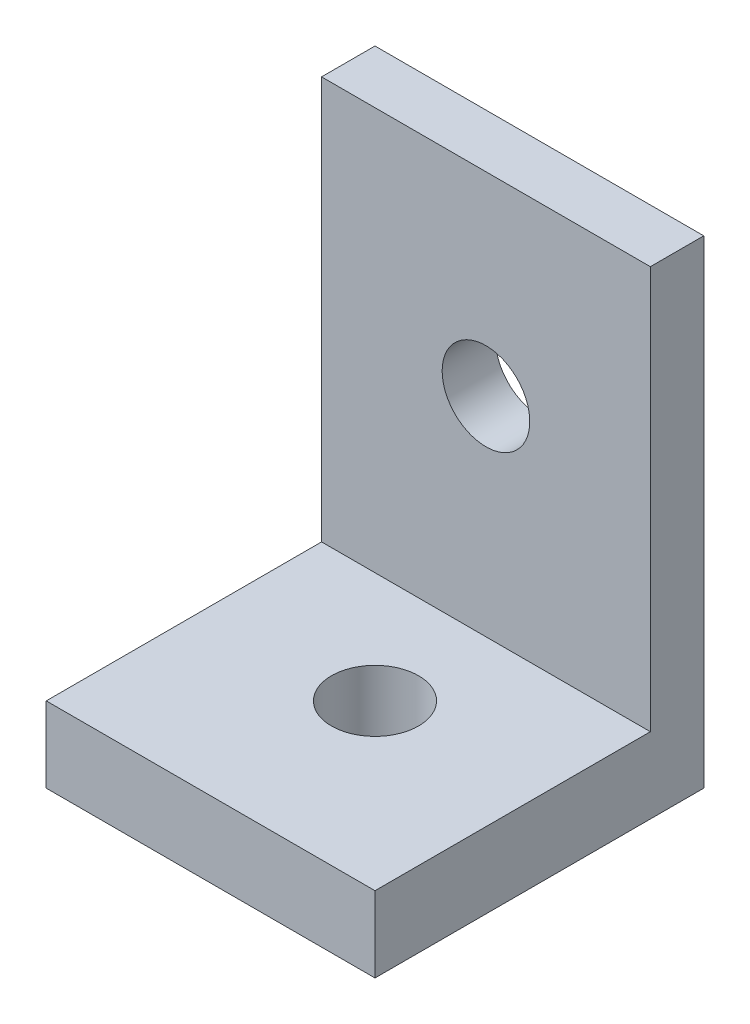
ISO-10303-21;
HEADER;
FILE_DESCRIPTION(('STEP AP214'),'2;1');
FILE_NAME('part.step','',(''),(''),'','','');
FILE_SCHEMA(('AUTOMOTIVE_DESIGN { 1 0 10303 214 1 1 1 1 }'));
ENDSEC;
DATA;
#1=APPLICATION_CONTEXT('core data for automotive mechanical design processes');
#2=APPLICATION_PROTOCOL_DEFINITION('international standard','automotive_design',2000,#1);
#3=PRODUCT_CONTEXT('',#1,'mechanical');
#4=PRODUCT('Part','Part','',(#3));
#5=PRODUCT_RELATED_PRODUCT_CATEGORY('part','',(#4));
#6=PRODUCT_DEFINITION_FORMATION('','',#4);
#7=PRODUCT_DEFINITION_CONTEXT('part definition',#1,'design');
#8=PRODUCT_DEFINITION('design','',#6,#7);
#9=PRODUCT_DEFINITION_SHAPE('','',#8);
#10=(LENGTH_UNIT() NAMED_UNIT(*) SI_UNIT(.MILLI.,.METRE.));
#11=(NAMED_UNIT(*) PLANE_ANGLE_UNIT() SI_UNIT($,.RADIAN.));
#12=(NAMED_UNIT(*) SI_UNIT($,.STERADIAN.) SOLID_ANGLE_UNIT());
#13=UNCERTAINTY_MEASURE_WITH_UNIT(LENGTH_MEASURE(1.E-05),#10,'distance_accuracy_value','');
#14=(GEOMETRIC_REPRESENTATION_CONTEXT(3) GLOBAL_UNCERTAINTY_ASSIGNED_CONTEXT((#13)) GLOBAL_UNIT_ASSIGNED_CONTEXT((#10,
#11,#12)) REPRESENTATION_CONTEXT('',''));
#15=CARTESIAN_POINT('',(0.,0.,0.));
#16=DIRECTION('',(0.,0.,1.));
#17=DIRECTION('',(1.,0.,0.));
#18=AXIS2_PLACEMENT_3D('',#15,#16,#17);
#19=CARTESIAN_POINT('',(0.,4.6,0.));
#20=DIRECTION('',(0.,-1.,0.));
#21=DIRECTION('',(0.,0.,-1.));
#22=AXIS2_PLACEMENT_3D('',#19,#20,#21);
#23=PLANE('',#22);
#24=CARTESIAN_POINT('',(0.,4.6,0.));
#25=DIRECTION('',(0.,1.,0.));
#26=DIRECTION('',(0.,0.,1.));
#27=AXIS2_PLACEMENT_3D('',#24,#25,#26);
#28=CIRCLE('',#27,2.65);
#29=CARTESIAN_POINT('',(0.,4.6,2.65));
#30=VERTEX_POINT('',#29);
#31=EDGE_CURVE('E100',#30,#30,#28,.T.);
#32=ORIENTED_EDGE('',*,*,#31,.F.);
#33=EDGE_LOOP('',(#32));
#34=FACE_BOUND('',#33,.T.);
#35=DIRECTION('',(1.,0.,0.));
#36=VECTOR('',#35,1.);
#37=CARTESIAN_POINT('',(-10.,4.6,-6.75000000000001));
#38=LINE('',#37,#36);
#39=CARTESIAN_POINT('',(-10.,4.6,-6.75000000000001));
#40=VERTEX_POINT('',#39);
#41=CARTESIAN_POINT('',(10.,4.6,-6.75000000000001));
#42=VERTEX_POINT('',#41);
#43=EDGE_CURVE('E53',#40,#42,#38,.T.);
#44=ORIENTED_EDGE('',*,*,#43,.F.);
#45=DIRECTION('',(0.,0.,1.));
#46=VECTOR('',#45,1.);
#47=CARTESIAN_POINT('',(-10.,4.6,10.));
#48=LINE('',#47,#46);
#49=CARTESIAN_POINT('',(-10.,4.6,10.));
#50=VERTEX_POINT('',#49);
#51=EDGE_CURVE('E146',#40,#50,#48,.T.);
#52=ORIENTED_EDGE('',*,*,#51,.T.);
#53=DIRECTION('',(1.,0.,0.));
#54=VECTOR('',#53,1.);
#55=CARTESIAN_POINT('',(-10.,4.6,10.));
#56=LINE('',#55,#54);
#57=CARTESIAN_POINT('',(10.,4.6,10.));
#58=VERTEX_POINT('',#57);
#59=EDGE_CURVE('E59',#50,#58,#56,.T.);
#60=ORIENTED_EDGE('',*,*,#59,.T.);
#61=DIRECTION('',(0.,0.,-1.));
#62=VECTOR('',#61,1.);
#63=CARTESIAN_POINT('',(10.,4.6,10.));
#64=LINE('',#63,#62);
#65=EDGE_CURVE('E88',#58,#42,#64,.T.);
#66=ORIENTED_EDGE('',*,*,#65,.T.);
#67=EDGE_LOOP('',(#44,#52,#60,#66));
#68=FACE_BOUND('',#67,.T.);
#69=ADVANCED_FACE('F37',(#34,#68),#23,.F.);
#70=CARTESIAN_POINT('',(0.,0.,0.));
#71=DIRECTION('',(0.,-1.,0.));
#72=DIRECTION('',(0.,0.,-1.));
#73=AXIS2_PLACEMENT_3D('',#70,#71,#72);
#74=PLANE('',#73);
#75=DIRECTION('',(0.,0.,-1.));
#76=VECTOR('',#75,1.);
#77=CARTESIAN_POINT('',(10.,0.,10.));
#78=LINE('',#77,#76);
#79=CARTESIAN_POINT('',(10.,0.,10.));
#80=VERTEX_POINT('',#79);
#81=CARTESIAN_POINT('',(10.,0.,-10.));
#82=VERTEX_POINT('',#81);
#83=EDGE_CURVE('E94',#80,#82,#78,.T.);
#84=ORIENTED_EDGE('',*,*,#83,.F.);
#85=DIRECTION('',(1.,0.,0.));
#86=VECTOR('',#85,1.);
#87=CARTESIAN_POINT('',(-10.,0.,10.));
#88=LINE('',#87,#86);
#89=CARTESIAN_POINT('',(-10.,0.,10.));
#90=VERTEX_POINT('',#89);
#91=EDGE_CURVE('E78',#90,#80,#88,.T.);
#92=ORIENTED_EDGE('',*,*,#91,.F.);
#93=DIRECTION('',(0.,0.,1.));
#94=VECTOR('',#93,1.);
#95=CARTESIAN_POINT('',(-10.,0.,10.));
#96=LINE('',#95,#94);
#97=CARTESIAN_POINT('',(-10.,0.,-10.));
#98=VERTEX_POINT('',#97);
#99=EDGE_CURVE('E89',#98,#90,#96,.T.);
#100=ORIENTED_EDGE('',*,*,#99,.F.);
#101=DIRECTION('',(-1.,0.,0.));
#102=VECTOR('',#101,1.);
#103=CARTESIAN_POINT('',(-10.,0.,-10.));
#104=LINE('',#103,#102);
#105=EDGE_CURVE('E99',#82,#98,#104,.T.);
#106=ORIENTED_EDGE('',*,*,#105,.F.);
#107=EDGE_LOOP('',(#84,#92,#100,#106));
#108=FACE_BOUND('',#107,.T.);
#109=CARTESIAN_POINT('',(0.,0.,0.));
#110=DIRECTION('',(0.,1.,0.));
#111=DIRECTION('',(0.,0.,1.));
#112=AXIS2_PLACEMENT_3D('',#109,#110,#111);
#113=CIRCLE('',#112,2.65);
#114=CARTESIAN_POINT('',(0.,0.,2.65));
#115=VERTEX_POINT('',#114);
#116=EDGE_CURVE('E104',#115,#115,#113,.T.);
#117=ORIENTED_EDGE('',*,*,#116,.T.);
#118=EDGE_LOOP('',(#117));
#119=FACE_BOUND('',#118,.T.);
#120=ADVANCED_FACE('F97',(#108,#119),#74,.T.);
#121=CARTESIAN_POINT('',(10.,4.6,10.));
#122=DIRECTION('',(-1.,0.,0.));
#123=DIRECTION('',(0.,0.,1.));
#124=AXIS2_PLACEMENT_3D('',#121,#122,#123);
#125=PLANE('',#124);
#126=ORIENTED_EDGE('',*,*,#83,.T.);
#127=DIRECTION('',(0.,-1.,0.));
#128=VECTOR('',#127,1.);
#129=CARTESIAN_POINT('',(10.,4.6,-10.));
#130=LINE('',#129,#128);
#131=CARTESIAN_POINT('',(10.,29.1,-10.));
#132=VERTEX_POINT('',#131);
#133=EDGE_CURVE('E11',#132,#82,#130,.T.);
#134=ORIENTED_EDGE('',*,*,#133,.F.);
#135=DIRECTION('',(0.,0.,-1.));
#136=VECTOR('',#135,1.);
#137=CARTESIAN_POINT('',(10.,29.1,-10.));
#138=LINE('',#137,#136);
#139=CARTESIAN_POINT('',(10.,29.1,-6.75000000000001));
#140=VERTEX_POINT('',#139);
#141=EDGE_CURVE('E132',#140,#132,#138,.T.);
#142=ORIENTED_EDGE('',*,*,#141,.F.);
#143=DIRECTION('',(0.,-1.,0.));
#144=VECTOR('',#143,1.);
#145=CARTESIAN_POINT('',(10.,29.1,-6.75000000000001));
#146=LINE('',#145,#144);
#147=EDGE_CURVE('E133',#140,#42,#146,.T.);
#148=ORIENTED_EDGE('',*,*,#147,.T.);
#149=ORIENTED_EDGE('',*,*,#65,.F.);
#150=DIRECTION('',(0.,-1.,0.));
#151=VECTOR('',#150,1.);
#152=CARTESIAN_POINT('',(10.,4.6,10.));
#153=LINE('',#152,#151);
#154=EDGE_CURVE('E81',#58,#80,#153,.T.);
#155=ORIENTED_EDGE('',*,*,#154,.T.);
#156=EDGE_LOOP('',(#126,#134,#142,#148,#149,#155));
#157=FACE_BOUND('',#156,.T.);
#158=ADVANCED_FACE('F39',(#157),#125,.F.);
#159=CARTESIAN_POINT('',(-10.,4.6,-10.));
#160=DIRECTION('',(0.,0.,1.));
#161=DIRECTION('',(1.,0.,0.));
#162=AXIS2_PLACEMENT_3D('',#159,#160,#161);
#163=PLANE('',#162);
#164=CARTESIAN_POINT('',(0.,17.275,-10.));
#165=DIRECTION('',(0.,0.,-1.));
#166=DIRECTION('',(-1.,0.,0.));
#167=AXIS2_PLACEMENT_3D('',#164,#165,#166);
#168=CIRCLE('',#167,2.665);
#169=CARTESIAN_POINT('',(-2.665,17.275,-10.));
#170=VERTEX_POINT('',#169);
#171=EDGE_CURVE('E156',#170,#170,#168,.T.);
#172=ORIENTED_EDGE('',*,*,#171,.F.);
#173=EDGE_LOOP('',(#172));
#174=FACE_BOUND('',#173,.T.);
#175=ORIENTED_EDGE('',*,*,#105,.T.);
#176=DIRECTION('',(0.,-1.,0.));
#177=VECTOR('',#176,1.);
#178=CARTESIAN_POINT('',(-10.,4.6,-10.));
#179=LINE('',#178,#177);
#180=CARTESIAN_POINT('',(-10.,29.1,-10.));
#181=VERTEX_POINT('',#180);
#182=EDGE_CURVE('E46',#181,#98,#179,.T.);
#183=ORIENTED_EDGE('',*,*,#182,.F.);
#184=DIRECTION('',(-1.,0.,0.));
#185=VECTOR('',#184,1.);
#186=CARTESIAN_POINT('',(-10.,29.1,-10.));
#187=LINE('',#186,#185);
#188=EDGE_CURVE('E124',#132,#181,#187,.T.);
#189=ORIENTED_EDGE('',*,*,#188,.F.);
#190=ORIENTED_EDGE('',*,*,#133,.T.);
#191=EDGE_LOOP('',(#175,#183,#189,#190));
#192=FACE_BOUND('',#191,.T.);
#193=ADVANCED_FACE('F122',(#174,#192),#163,.F.);
#194=CARTESIAN_POINT('',(-10.,4.6,10.));
#195=DIRECTION('',(1.,0.,0.));
#196=DIRECTION('',(0.,0.,-1.));
#197=AXIS2_PLACEMENT_3D('',#194,#195,#196);
#198=PLANE('',#197);
#199=ORIENTED_EDGE('',*,*,#99,.T.);
#200=DIRECTION('',(0.,-1.,0.));
#201=VECTOR('',#200,1.);
#202=CARTESIAN_POINT('',(-10.,4.6,10.));
#203=LINE('',#202,#201);
#204=EDGE_CURVE('E84',#50,#90,#203,.T.);
#205=ORIENTED_EDGE('',*,*,#204,.F.);
#206=ORIENTED_EDGE('',*,*,#51,.F.);
#207=DIRECTION('',(0.,-1.,0.));
#208=VECTOR('',#207,1.);
#209=CARTESIAN_POINT('',(-10.,29.1,-6.75000000000001));
#210=LINE('',#209,#208);
#211=CARTESIAN_POINT('',(-10.,29.1,-6.75000000000001));
#212=VERTEX_POINT('',#211);
#213=EDGE_CURVE('E135',#212,#40,#210,.T.);
#214=ORIENTED_EDGE('',*,*,#213,.F.);
#215=DIRECTION('',(0.,0.,1.));
#216=VECTOR('',#215,1.);
#217=CARTESIAN_POINT('',(-10.,29.1,-10.));
#218=LINE('',#217,#216);
#219=EDGE_CURVE('E118',#181,#212,#218,.T.);
#220=ORIENTED_EDGE('',*,*,#219,.F.);
#221=ORIENTED_EDGE('',*,*,#182,.T.);
#222=EDGE_LOOP('',(#199,#205,#206,#214,#220,#221));
#223=FACE_BOUND('',#222,.T.);
#224=ADVANCED_FACE('F115',(#223),#198,.F.);
#225=CARTESIAN_POINT('',(-10.,4.6,10.));
#226=DIRECTION('',(0.,0.,-1.));
#227=DIRECTION('',(-1.,0.,0.));
#228=AXIS2_PLACEMENT_3D('',#225,#226,#227);
#229=PLANE('',#228);
#230=ORIENTED_EDGE('',*,*,#91,.T.);
#231=ORIENTED_EDGE('',*,*,#154,.F.);
#232=ORIENTED_EDGE('',*,*,#59,.F.);
#233=ORIENTED_EDGE('',*,*,#204,.T.);
#234=EDGE_LOOP('',(#230,#231,#232,#233));
#235=FACE_BOUND('',#234,.T.);
#236=ADVANCED_FACE('F80',(#235),#229,.F.);
#237=CARTESIAN_POINT('',(0.,4.6,0.));
#238=DIRECTION('',(0.,-1.,0.));
#239=DIRECTION('',(0.,0.,-1.));
#240=AXIS2_PLACEMENT_3D('',#237,#238,#239);
#241=CYLINDRICAL_SURFACE('',#240,2.65);
#242=ORIENTED_EDGE('',*,*,#31,.T.);
#243=EDGE_LOOP('',(#242));
#244=FACE_BOUND('',#243,.T.);
#245=ORIENTED_EDGE('',*,*,#116,.F.);
#246=EDGE_LOOP('',(#245));
#247=FACE_BOUND('',#246,.T.);
#248=ADVANCED_FACE('F180',(#244,#247),#241,.F.);
#249=CARTESIAN_POINT('',(-10.,29.1,-6.75000000000001));
#250=DIRECTION('',(0.,0.,-1.));
#251=DIRECTION('',(-1.,0.,0.));
#252=AXIS2_PLACEMENT_3D('',#249,#250,#251);
#253=PLANE('',#252);
#254=CARTESIAN_POINT('',(0.,17.275,-6.75000000000001));
#255=DIRECTION('',(0.,0.,-1.));
#256=DIRECTION('',(-1.,0.,0.));
#257=AXIS2_PLACEMENT_3D('',#254,#255,#256);
#258=CIRCLE('',#257,2.665);
#259=CARTESIAN_POINT('',(-2.665,17.275,-6.75000000000001));
#260=VERTEX_POINT('',#259);
#261=EDGE_CURVE('E41',#260,#260,#258,.T.);
#262=ORIENTED_EDGE('',*,*,#261,.T.);
#263=EDGE_LOOP('',(#262));
#264=FACE_BOUND('',#263,.T.);
#265=ORIENTED_EDGE('',*,*,#43,.T.);
#266=ORIENTED_EDGE('',*,*,#147,.F.);
#267=DIRECTION('',(1.,0.,0.));
#268=VECTOR('',#267,1.);
#269=CARTESIAN_POINT('',(-10.,29.1,-6.75000000000001));
#270=LINE('',#269,#268);
#271=EDGE_CURVE('E137',#212,#140,#270,.T.);
#272=ORIENTED_EDGE('',*,*,#271,.F.);
#273=ORIENTED_EDGE('',*,*,#213,.T.);
#274=EDGE_LOOP('',(#265,#266,#272,#273));
#275=FACE_BOUND('',#274,.T.);
#276=ADVANCED_FACE('F149',(#264,#275),#253,.F.);
#277=CARTESIAN_POINT('',(0.,29.1,0.));
#278=DIRECTION('',(0.,1.,0.));
#279=DIRECTION('',(0.,0.,1.));
#280=AXIS2_PLACEMENT_3D('',#277,#278,#279);
#281=PLANE('',#280);
#282=ORIENTED_EDGE('',*,*,#219,.T.);
#283=ORIENTED_EDGE('',*,*,#271,.T.);
#284=ORIENTED_EDGE('',*,*,#141,.T.);
#285=ORIENTED_EDGE('',*,*,#188,.T.);
#286=EDGE_LOOP('',(#282,#283,#284,#285));
#287=FACE_BOUND('',#286,.T.);
#288=ADVANCED_FACE('F128',(#287),#281,.T.);
#289=CARTESIAN_POINT('',(0.,17.275,10.));
#290=DIRECTION('',(0.,0.,-1.));
#291=DIRECTION('',(-1.,0.,0.));
#292=AXIS2_PLACEMENT_3D('',#289,#290,#291);
#293=CYLINDRICAL_SURFACE('',#292,2.665);
#294=ORIENTED_EDGE('',*,*,#171,.T.);
#295=EDGE_LOOP('',(#294));
#296=FACE_BOUND('',#295,.T.);
#297=ORIENTED_EDGE('',*,*,#261,.F.);
#298=EDGE_LOOP('',(#297));
#299=FACE_BOUND('',#298,.T.);
#300=ADVANCED_FACE('F164',(#296,#299),#293,.F.);
#301=CLOSED_SHELL('',(#69,#120,#158,#193,#224,#236,#248,#276,#288,#300));
#302=MANIFOLD_SOLID_BREP('B2',#301);
#303=ADVANCED_BREP_SHAPE_REPRESENTATION('',(#18,#302),#14);
#304=SHAPE_DEFINITION_REPRESENTATION(#9,#303);
ENDSEC;
END-ISO-10303-21;
